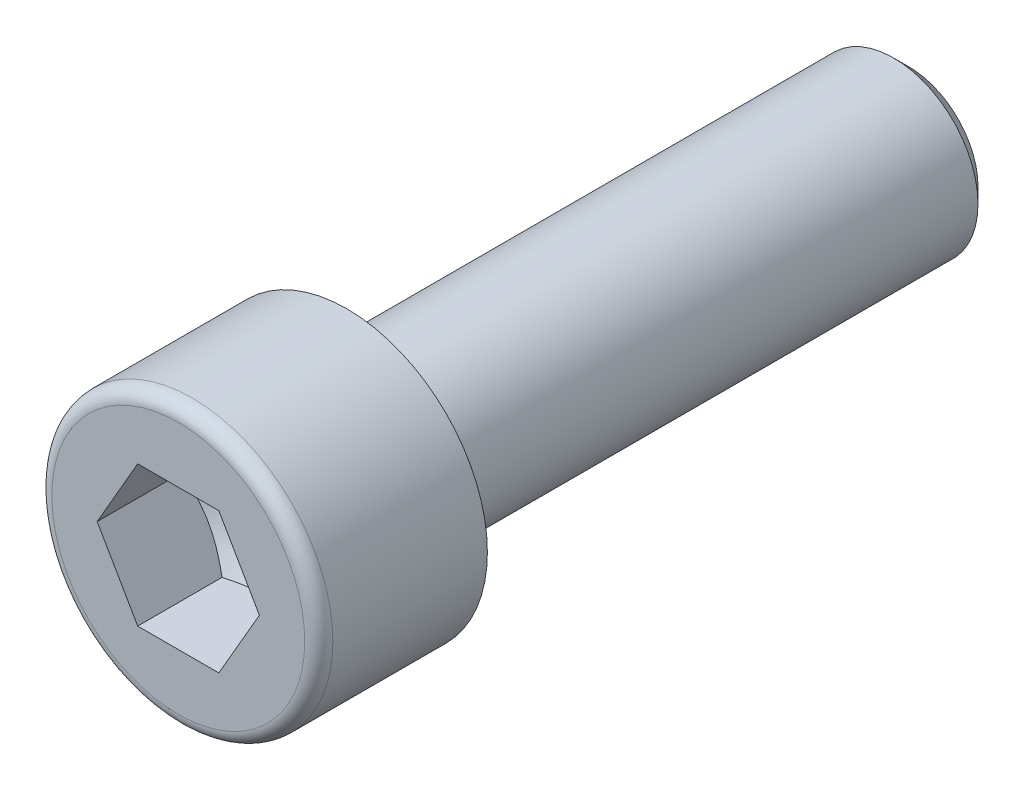
ISO-10303-21;
HEADER;
FILE_DESCRIPTION(('STEP AP214'),'2;1');
FILE_NAME('part.step','',(''),(''),'','','');
FILE_SCHEMA(('AUTOMOTIVE_DESIGN { 1 0 10303 214 1 1 1 1 }'));
ENDSEC;
DATA;
#1=APPLICATION_CONTEXT('core data for automotive mechanical design processes');
#2=APPLICATION_PROTOCOL_DEFINITION('international standard','automotive_design',2000,#1);
#3=PRODUCT_CONTEXT('',#1,'mechanical');
#4=PRODUCT('Part','Part','',(#3));
#5=PRODUCT_RELATED_PRODUCT_CATEGORY('part','',(#4));
#6=PRODUCT_DEFINITION_FORMATION('','',#4);
#7=PRODUCT_DEFINITION_CONTEXT('part definition',#1,'design');
#8=PRODUCT_DEFINITION('design','',#6,#7);
#9=PRODUCT_DEFINITION_SHAPE('','',#8);
#10=(LENGTH_UNIT() NAMED_UNIT(*) SI_UNIT(.MILLI.,.METRE.));
#11=(NAMED_UNIT(*) PLANE_ANGLE_UNIT() SI_UNIT($,.RADIAN.));
#12=(NAMED_UNIT(*) SI_UNIT($,.STERADIAN.) SOLID_ANGLE_UNIT());
#13=UNCERTAINTY_MEASURE_WITH_UNIT(LENGTH_MEASURE(1.E-05),#10,'distance_accuracy_value','');
#14=(GEOMETRIC_REPRESENTATION_CONTEXT(3) GLOBAL_UNCERTAINTY_ASSIGNED_CONTEXT((#13)) GLOBAL_UNIT_ASSIGNED_CONTEXT((#10,
#11,#12)) REPRESENTATION_CONTEXT('',''));
#15=CARTESIAN_POINT('',(0.,0.,0.));
#16=DIRECTION('',(0.,0.,1.));
#17=DIRECTION('',(1.,0.,0.));
#18=AXIS2_PLACEMENT_3D('',#15,#16,#17);
#19=CARTESIAN_POINT('',(0.,0.,6.));
#20=DIRECTION('',(0.,0.,1.));
#21=DIRECTION('',(1.,0.,0.));
#22=AXIS2_PLACEMENT_3D('',#19,#20,#21);
#23=PLANE('',#22);
#24=CARTESIAN_POINT('',(0.,0.,6.));
#25=DIRECTION('',(0.,0.,1.));
#26=DIRECTION('',(1.,0.,0.));
#27=AXIS2_PLACEMENT_3D('',#24,#25,#26);
#28=CIRCLE('',#27,4.5);
#29=CARTESIAN_POINT('',(4.5,0.,6.));
#30=VERTEX_POINT('',#29);
#31=EDGE_CURVE('E11',#30,#30,#28,.T.);
#32=ORIENTED_EDGE('',*,*,#31,.T.);
#33=EDGE_LOOP('',(#32));
#34=FACE_BOUND('',#33,.T.);
#35=DIRECTION('',(1.,0.,0.));
#36=VECTOR('',#35,1.);
#37=CARTESIAN_POINT('',(-1.443375,2.49999883437473,6.));
#38=LINE('',#37,#36);
#39=CARTESIAN_POINT('',(-1.443375,2.49999883437473,6.));
#40=VERTEX_POINT('',#39);
#41=CARTESIAN_POINT('',(1.443375,2.49999883437473,6.));
#42=VERTEX_POINT('',#41);
#43=EDGE_CURVE('E91',#40,#42,#38,.T.);
#44=ORIENTED_EDGE('',*,*,#43,.T.);
#45=DIRECTION('',(0.5,-0.866025403784439,0.));
#46=VECTOR('',#45,1.);
#47=CARTESIAN_POINT('',(1.443375,2.49999883437473,6.));
#48=LINE('',#47,#46);
#49=CARTESIAN_POINT('',(2.88675,0.,6.));
#50=VERTEX_POINT('',#49);
#51=EDGE_CURVE('E30',#42,#50,#48,.T.);
#52=ORIENTED_EDGE('',*,*,#51,.T.);
#53=DIRECTION('',(-0.5,-0.866025403784439,0.));
#54=VECTOR('',#53,1.);
#55=CARTESIAN_POINT('',(2.88675,0.,6.));
#56=LINE('',#55,#54);
#57=CARTESIAN_POINT('',(1.443375,-2.49999883437473,6.));
#58=VERTEX_POINT('',#57);
#59=EDGE_CURVE('E168',#50,#58,#56,.T.);
#60=ORIENTED_EDGE('',*,*,#59,.T.);
#61=DIRECTION('',(-1.,0.,0.));
#62=VECTOR('',#61,1.);
#63=CARTESIAN_POINT('',(1.443375,-2.49999883437473,6.));
#64=LINE('',#63,#62);
#65=CARTESIAN_POINT('',(-1.443375,-2.49999883437473,6.));
#66=VERTEX_POINT('',#65);
#67=EDGE_CURVE('E164',#58,#66,#64,.T.);
#68=ORIENTED_EDGE('',*,*,#67,.T.);
#69=DIRECTION('',(-0.5,0.866025403784439,0.));
#70=VECTOR('',#69,1.);
#71=CARTESIAN_POINT('',(-1.443375,-2.49999883437473,6.));
#72=LINE('',#71,#70);
#73=CARTESIAN_POINT('',(-2.88675,0.,6.));
#74=VERTEX_POINT('',#73);
#75=EDGE_CURVE('E159',#66,#74,#72,.T.);
#76=ORIENTED_EDGE('',*,*,#75,.T.);
#77=DIRECTION('',(0.5,0.866025403784439,0.));
#78=VECTOR('',#77,1.);
#79=CARTESIAN_POINT('',(-2.88675,0.,6.));
#80=LINE('',#79,#78);
#81=EDGE_CURVE('E95',#74,#40,#80,.T.);
#82=ORIENTED_EDGE('',*,*,#81,.T.);
#83=EDGE_LOOP('',(#44,#52,#60,#68,#76,#82));
#84=FACE_BOUND('',#83,.T.);
#85=ADVANCED_FACE('F16',(#34,#84),#23,.T.);
#86=CARTESIAN_POINT('',(0.,0.,5.5));
#87=DIRECTION('',(0.,0.,1.));
#88=DIRECTION('',(1.,0.,0.));
#89=AXIS2_PLACEMENT_3D('',#86,#87,#88);
#90=TOROIDAL_SURFACE('',#89,4.5,0.5);
#91=ORIENTED_EDGE('',*,*,#31,.F.);
#92=EDGE_LOOP('',(#91));
#93=FACE_BOUND('',#92,.T.);
#94=CARTESIAN_POINT('',(0.,0.,5.5));
#95=DIRECTION('',(0.,0.,1.));
#96=DIRECTION('',(1.,0.,0.));
#97=AXIS2_PLACEMENT_3D('',#94,#95,#96);
#98=CIRCLE('',#97,5.);
#99=CARTESIAN_POINT('',(5.,0.,5.5));
#100=VERTEX_POINT('',#99);
#101=EDGE_CURVE('E23',#100,#100,#98,.T.);
#102=ORIENTED_EDGE('',*,*,#101,.T.);
#103=EDGE_LOOP('',(#102));
#104=FACE_BOUND('',#103,.T.);
#105=ADVANCED_FACE('F132',(#93,#104),#90,.T.);
#106=CARTESIAN_POINT('',(0.,0.,6.));
#107=DIRECTION('',(0.,0.,1.));
#108=DIRECTION('',(1.,0.,0.));
#109=AXIS2_PLACEMENT_3D('',#106,#107,#108);
#110=CYLINDRICAL_SURFACE('',#109,5.);
#111=CARTESIAN_POINT('',(0.,0.,0.));
#112=DIRECTION('',(0.,0.,1.));
#113=DIRECTION('',(1.,0.,0.));
#114=AXIS2_PLACEMENT_3D('',#111,#112,#113);
#115=CIRCLE('',#114,5.);
#116=CARTESIAN_POINT('',(5.,0.,0.));
#117=VERTEX_POINT('',#116);
#118=EDGE_CURVE('E127',#117,#117,#115,.T.);
#119=ORIENTED_EDGE('',*,*,#118,.T.);
#120=EDGE_LOOP('',(#119));
#121=FACE_BOUND('',#120,.T.);
#122=ORIENTED_EDGE('',*,*,#101,.F.);
#123=EDGE_LOOP('',(#122));
#124=FACE_BOUND('',#123,.T.);
#125=ADVANCED_FACE('F134',(#121,#124),#110,.T.);
#126=CARTESIAN_POINT('',(0.,5.,0.));
#127=DIRECTION('',(0.,0.,-1.));
#128=DIRECTION('',(-1.,0.,0.));
#129=AXIS2_PLACEMENT_3D('',#126,#127,#128);
#130=PLANE('',#129);
#131=CARTESIAN_POINT('',(0.,0.,0.));
#132=DIRECTION('',(0.,0.,1.));
#133=DIRECTION('',(1.,0.,0.));
#134=AXIS2_PLACEMENT_3D('',#131,#132,#133);
#135=CIRCLE('',#134,3.3);
#136=CARTESIAN_POINT('',(3.3,0.,0.));
#137=VERTEX_POINT('',#136);
#138=EDGE_CURVE('E124',#137,#137,#135,.T.);
#139=ORIENTED_EDGE('',*,*,#138,.T.);
#140=EDGE_LOOP('',(#139));
#141=FACE_BOUND('',#140,.T.);
#142=ORIENTED_EDGE('',*,*,#118,.F.);
#143=EDGE_LOOP('',(#142));
#144=FACE_BOUND('',#143,.T.);
#145=ADVANCED_FACE('F136',(#141,#144),#130,.T.);
#146=CARTESIAN_POINT('',(0.,0.,-0.3));
#147=DIRECTION('',(0.,0.,1.));
#148=DIRECTION('',(1.,0.,0.));
#149=AXIS2_PLACEMENT_3D('',#146,#147,#148);
#150=TOROIDAL_SURFACE('',#149,3.3,0.3);
#151=CARTESIAN_POINT('',(0.,0.,-0.3));
#152=DIRECTION('',(0.,0.,1.));
#153=DIRECTION('',(1.,0.,0.));
#154=AXIS2_PLACEMENT_3D('',#151,#152,#153);
#155=CIRCLE('',#154,3.);
#156=CARTESIAN_POINT('',(3.,0.,-0.3));
#157=VERTEX_POINT('',#156);
#158=EDGE_CURVE('E121',#157,#157,#155,.T.);
#159=ORIENTED_EDGE('',*,*,#158,.T.);
#160=EDGE_LOOP('',(#159));
#161=FACE_BOUND('',#160,.T.);
#162=ORIENTED_EDGE('',*,*,#138,.F.);
#163=EDGE_LOOP('',(#162));
#164=FACE_BOUND('',#163,.T.);
#165=ADVANCED_FACE('F144',(#161,#164),#150,.F.);
#166=CARTESIAN_POINT('',(0.,0.,6.));
#167=DIRECTION('',(0.,0.,1.));
#168=DIRECTION('',(1.,0.,0.));
#169=AXIS2_PLACEMENT_3D('',#166,#167,#168);
#170=CYLINDRICAL_SURFACE('',#169,3.);
#171=CARTESIAN_POINT('',(0.,0.,-0.301));
#172=DIRECTION('',(0.,0.,1.));
#173=DIRECTION('',(1.,0.,0.));
#174=AXIS2_PLACEMENT_3D('',#171,#172,#173);
#175=CIRCLE('',#174,3.);
#176=CARTESIAN_POINT('',(3.,0.,-0.301));
#177=VERTEX_POINT('',#176);
#178=EDGE_CURVE('E118',#177,#177,#175,.T.);
#179=ORIENTED_EDGE('',*,*,#178,.T.);
#180=EDGE_LOOP('',(#179));
#181=FACE_BOUND('',#180,.T.);
#182=ORIENTED_EDGE('',*,*,#158,.F.);
#183=EDGE_LOOP('',(#182));
#184=FACE_BOUND('',#183,.T.);
#185=ADVANCED_FACE('F363',(#181,#184),#170,.T.);
#186=CARTESIAN_POINT('',(0.,0.,-0.301));
#187=DIRECTION('',(0.,0.,1.));
#188=DIRECTION('',(1.,0.,0.));
#189=AXIS2_PLACEMENT_3D('',#186,#187,#188);
#190=CONICAL_SURFACE('',#189,3.,0.523598775598299);
#191=CARTESIAN_POINT('',(0.,0.,-1.23847249959665));
#192=DIRECTION('',(0.,0.,1.));
#193=DIRECTION('',(1.,0.,0.));
#194=AXIS2_PLACEMENT_3D('',#191,#192,#193);
#195=CIRCLE('',#194,2.45875);
#196=CARTESIAN_POINT('',(2.45875,0.,-1.23847249959665));
#197=VERTEX_POINT('',#196);
#198=EDGE_CURVE('E115',#197,#197,#195,.T.);
#199=ORIENTED_EDGE('',*,*,#198,.T.);
#200=EDGE_LOOP('',(#199));
#201=FACE_BOUND('',#200,.T.);
#202=ORIENTED_EDGE('',*,*,#178,.F.);
#203=EDGE_LOOP('',(#202));
#204=FACE_BOUND('',#203,.T.);
#205=ADVANCED_FACE('F352',(#201,#204),#190,.T.);
#206=CARTESIAN_POINT('',(0.,2.45875,-1.23847249959665));
#207=DIRECTION('',(0.,0.,1.));
#208=DIRECTION('',(1.,0.,0.));
#209=AXIS2_PLACEMENT_3D('',#206,#207,#208);
#210=PLANE('',#209);
#211=CARTESIAN_POINT('',(0.,0.,-1.23847249959665));
#212=DIRECTION('',(0.,0.,1.));
#213=DIRECTION('',(1.,0.,0.));
#214=AXIS2_PLACEMENT_3D('',#211,#212,#213);
#215=CIRCLE('',#214,3.);
#216=CARTESIAN_POINT('',(3.,0.,-1.23847249959665));
#217=VERTEX_POINT('',#216);
#218=EDGE_CURVE('E112',#217,#217,#215,.T.);
#219=ORIENTED_EDGE('',*,*,#218,.T.);
#220=EDGE_LOOP('',(#219));
#221=FACE_BOUND('',#220,.T.);
#222=ORIENTED_EDGE('',*,*,#198,.F.);
#223=EDGE_LOOP('',(#222));
#224=FACE_BOUND('',#223,.T.);
#225=ADVANCED_FACE('F341',(#221,#224),#210,.T.);
#226=CARTESIAN_POINT('',(0.,0.,6.));
#227=DIRECTION('',(0.,0.,1.));
#228=DIRECTION('',(1.,0.,0.));
#229=AXIS2_PLACEMENT_3D('',#226,#227,#228);
#230=CYLINDRICAL_SURFACE('',#229,3.);
#231=CARTESIAN_POINT('',(0.,0.,-19.45875));
#232=DIRECTION('',(0.,0.,1.));
#233=DIRECTION('',(1.,0.,0.));
#234=AXIS2_PLACEMENT_3D('',#231,#232,#233);
#235=CIRCLE('',#234,3.);
#236=CARTESIAN_POINT('',(3.,0.,-19.45875));
#237=VERTEX_POINT('',#236);
#238=EDGE_CURVE('E109',#237,#237,#235,.T.);
#239=ORIENTED_EDGE('',*,*,#238,.T.);
#240=EDGE_LOOP('',(#239));
#241=FACE_BOUND('',#240,.T.);
#242=ORIENTED_EDGE('',*,*,#218,.F.);
#243=EDGE_LOOP('',(#242));
#244=FACE_BOUND('',#243,.T.);
#245=ADVANCED_FACE('F330',(#241,#244),#230,.T.);
#246=CARTESIAN_POINT('',(0.,0.,-19.45875));
#247=DIRECTION('',(0.,0.,1.));
#248=DIRECTION('',(1.,0.,0.));
#249=AXIS2_PLACEMENT_3D('',#246,#247,#248);
#250=CONICAL_SURFACE('',#249,3.,0.78539816339745);
#251=CARTESIAN_POINT('',(0.,0.,-20.));
#252=DIRECTION('',(0.,0.,1.));
#253=DIRECTION('',(1.,0.,0.));
#254=AXIS2_PLACEMENT_3D('',#251,#252,#253);
#255=CIRCLE('',#254,2.45875);
#256=CARTESIAN_POINT('',(2.45875,0.,-20.));
#257=VERTEX_POINT('',#256);
#258=EDGE_CURVE('E106',#257,#257,#255,.T.);
#259=ORIENTED_EDGE('',*,*,#258,.T.);
#260=EDGE_LOOP('',(#259));
#261=FACE_BOUND('',#260,.T.);
#262=ORIENTED_EDGE('',*,*,#238,.F.);
#263=EDGE_LOOP('',(#262));
#264=FACE_BOUND('',#263,.T.);
#265=ADVANCED_FACE('F320',(#261,#264),#250,.T.);
#266=CARTESIAN_POINT('',(0.,2.45875,-20.));
#267=DIRECTION('',(0.,0.,-1.));
#268=DIRECTION('',(-1.,0.,0.));
#269=AXIS2_PLACEMENT_3D('',#266,#267,#268);
#270=PLANE('',#269);
#271=ORIENTED_EDGE('',*,*,#258,.F.);
#272=EDGE_LOOP('',(#271));
#273=FACE_BOUND('',#272,.T.);
#274=ADVANCED_FACE('F224',(#273),#270,.T.);
#275=CARTESIAN_POINT('',(1.443375,2.49999883437473,1.33333411041685));
#276=DIRECTION('',(-0.866025403784439,-0.5,0.));
#277=DIRECTION('',(-0.5,0.866025403784439,0.));
#278=AXIS2_PLACEMENT_3D('',#275,#276,#277);
#279=PLANE('',#278);
#280=DIRECTION('',(0.,0.,1.));
#281=VECTOR('',#280,1.);
#282=CARTESIAN_POINT('',(2.88675,0.,1.33333411041685));
#283=LINE('',#282,#281);
#284=CARTESIAN_POINT('',(2.88675,0.,3.));
#285=VERTEX_POINT('',#284);
#286=EDGE_CURVE('E104',#285,#50,#283,.T.);
#287=ORIENTED_EDGE('',*,*,#286,.T.);
#288=ORIENTED_EDGE('',*,*,#51,.F.);
#289=DIRECTION('',(0.,0.,1.));
#290=VECTOR('',#289,1.);
#291=CARTESIAN_POINT('',(1.443375,2.49999883437473,1.33333411041685));
#292=LINE('',#291,#290);
#293=CARTESIAN_POINT('',(1.443375,2.49999883437473,3.));
#294=VERTEX_POINT('',#293);
#295=EDGE_CURVE('E85',#294,#42,#292,.T.);
#296=ORIENTED_EDGE('',*,*,#295,.F.);
#297=CARTESIAN_POINT('',(2.88675011547006,-1.99999999863357E-07,3.00000006666667));
#298=CARTESIAN_POINT('',(2.82332252366581,0.10985961160669,2.96336950967828));
#299=CARTESIAN_POINT('',(2.75934742579574,0.220667731536841,2.93005593436152));
#300=CARTESIAN_POINT('',(2.63028954387127,0.444202540147256,2.87190808727666));
#301=CARTESIAN_POINT('',(2.56520446745334,0.556933199317605,2.84709438377072));
#302=CARTESIAN_POINT('',(2.43584088140159,0.780997503008549,2.80847006268835));
#303=CARTESIAN_POINT('',(2.37158227044588,0.892296682007636,2.7944023489199));
#304=CARTESIAN_POINT('',(2.24276284805613,1.11541846658835,2.77761157054617));
#305=CARTESIAN_POINT('',(2.17820250452486,1.22724026173863,2.77487459839365));
#306=CARTESIAN_POINT('',(2.05757841328359,1.43616731638533,2.78058295689796));
#307=CARTESIAN_POINT('',(2.00149656500914,1.53330392697905,2.7876266963322));
#308=CARTESIAN_POINT('',(1.8896982234341,1.72694433478895,2.80994670830941));
#309=CARTESIAN_POINT('',(1.83398211652594,1.82344746275382,2.82523059787334));
#310=CARTESIAN_POINT('',(1.72195345954662,2.01748678854571,2.86343736615338));
#311=CARTESIAN_POINT('',(1.66565508107193,2.11499844044762,2.88652212541071));
#312=CARTESIAN_POINT('',(1.55389777191142,2.3085677780308,2.93891477048972));
#313=CARTESIAN_POINT('',(1.49843741058811,2.40462794164891,2.96821035401504));
#314=CARTESIAN_POINT('',(1.44337488452994,2.49999903437473,3.00000006666667));
#315=B_SPLINE_CURVE_WITH_KNOTS('',3,(#297,#298,#299,#300,#301,#302,#303,#304,#305,#306,#307,
#308,#309,#310,#311,#312,#313,#314),.UNSPECIFIED.,.F.,.F.,(4,2,2,2,2,2,2,2,4),(0.,
0.396269845497158,0.793491933375094,1.18088400346178,1.56780044062153,1.90463400294076,
2.24177946228527,2.58640119548574,2.93034658115087),.UNSPECIFIED.);
#316=EDGE_CURVE('E78',#285,#294,#315,.T.);
#317=ORIENTED_EDGE('',*,*,#316,.F.);
#318=EDGE_LOOP('',(#287,#288,#296,#317));
#319=FACE_BOUND('',#318,.T.);
#320=ADVANCED_FACE('F86',(#319),#279,.T.);
#321=CARTESIAN_POINT('',(2.88675,0.,1.33333411041685));
#322=DIRECTION('',(-0.866025403784439,0.5,0.));
#323=DIRECTION('',(0.5,0.866025403784439,0.));
#324=AXIS2_PLACEMENT_3D('',#321,#322,#323);
#325=PLANE('',#324);
#326=DIRECTION('',(0.,0.,1.));
#327=VECTOR('',#326,1.);
#328=CARTESIAN_POINT('',(1.443375,-2.49999883437473,1.33333411041685));
#329=LINE('',#328,#327);
#330=CARTESIAN_POINT('',(1.443375,-2.49999883437473,3.));
#331=VERTEX_POINT('',#330);
#332=EDGE_CURVE('E102',#331,#58,#329,.T.);
#333=ORIENTED_EDGE('',*,*,#332,.T.);
#334=ORIENTED_EDGE('',*,*,#59,.F.);
#335=ORIENTED_EDGE('',*,*,#286,.F.);
#336=CARTESIAN_POINT('',(1.44337488452995,-2.49999903437473,3.00000006666667));
#337=CARTESIAN_POINT('',(1.50680247633419,-2.39013922276804,2.96336950967828));
#338=CARTESIAN_POINT('',(1.57077757420426,-2.27933110283789,2.93005593436152));
#339=CARTESIAN_POINT('',(1.69983545612873,-2.05579629422747,2.87190808727666));
#340=CARTESIAN_POINT('',(1.76492053254666,-1.94306563505712,2.84709438377072));
#341=CARTESIAN_POINT('',(1.89428411859841,-1.71900133136618,2.80847006268835));
#342=CARTESIAN_POINT('',(1.95854272955412,-1.60770215236709,2.7944023489199));
#343=CARTESIAN_POINT('',(2.08736215194387,-1.38458036778637,2.77761157054617));
#344=CARTESIAN_POINT('',(2.15192249547514,-1.2727585726361,2.77487459839365));
#345=CARTESIAN_POINT('',(2.27254658671641,-1.06383151798939,2.78058295689796));
#346=CARTESIAN_POINT('',(2.32862843499086,-0.96669490739568,2.7876266963322));
#347=CARTESIAN_POINT('',(2.4404267765659,-0.773054499585779,2.8099467083094));
#348=CARTESIAN_POINT('',(2.49614288347406,-0.676551371620907,2.82523059787334));
#349=CARTESIAN_POINT('',(2.60817154045338,-0.48251204582902,2.86343736615338));
#350=CARTESIAN_POINT('',(2.66446991892807,-0.385000393927105,2.88652212541071));
#351=CARTESIAN_POINT('',(2.77622722808858,-0.191431056343928,2.93891477048972));
#352=CARTESIAN_POINT('',(2.83168758941189,-0.0953708927258217,2.96821035401504));
#353=CARTESIAN_POINT('',(2.88675011547006,1.99999999976406E-07,3.00000006666667));
#354=B_SPLINE_CURVE_WITH_KNOTS('',3,(#336,#337,#338,#339,#340,#341,#342,#343,#344,#345,#346,
#347,#348,#349,#350,#351,#352,#353),.UNSPECIFIED.,.F.,.F.,(4,2,2,2,2,2,2,2,4),(0.,
0.396269845497159,0.793491933375095,1.18088400346178,1.56780044062153,1.90463400294076,
2.24177946228527,2.58640119548574,2.93034658115087),.UNSPECIFIED.);
#355=EDGE_CURVE('E82',#331,#285,#354,.T.);
#356=ORIENTED_EDGE('',*,*,#355,.F.);
#357=EDGE_LOOP('',(#333,#334,#335,#356));
#358=FACE_BOUND('',#357,.T.);
#359=ADVANCED_FACE('F215',(#358),#325,.T.);
#360=CARTESIAN_POINT('',(1.443375,-2.49999883437473,1.33333411041685));
#361=DIRECTION('',(0.,1.,0.));
#362=DIRECTION('',(1.,0.,0.));
#363=AXIS2_PLACEMENT_3D('',#360,#361,#362);
#364=PLANE('',#363);
#365=DIRECTION('',(0.,0.,1.));
#366=VECTOR('',#365,1.);
#367=CARTESIAN_POINT('',(-1.443375,-2.49999883437473,1.33333411041685));
#368=LINE('',#367,#366);
#369=CARTESIAN_POINT('',(-1.443375,-2.49999883437473,3.));
#370=VERTEX_POINT('',#369);
#371=EDGE_CURVE('E100',#370,#66,#368,.T.);
#372=ORIENTED_EDGE('',*,*,#371,.T.);
#373=ORIENTED_EDGE('',*,*,#67,.F.);
#374=ORIENTED_EDGE('',*,*,#332,.F.);
#375=CARTESIAN_POINT('',(-3.73786106214978,-2.49999883437473,3.92958778907324));
#376=CARTESIAN_POINT('',(-3.62896491195938,-2.49999883437473,3.87734398831161));
#377=CARTESIAN_POINT('',(-3.51980131110672,-2.49999883437473,3.82564701620672));
#378=CARTESIAN_POINT('',(-3.30079453275696,-2.49999883437473,3.72366066581967));
#379=CARTESIAN_POINT('',(-3.19095123199839,-2.49999883437473,3.67337155256083));
#380=CARTESIAN_POINT('',(-2.96980741137606,-2.49999883437473,3.57423266172552));
#381=CARTESIAN_POINT('',(-2.85850208851781,-2.49999883437473,3.5253935570836));
#382=CARTESIAN_POINT('',(-2.63494533066189,-2.49999883437473,3.42993961665011));
#383=CARTESIAN_POINT('',(-2.52269394848717,-2.49999883437473,3.38332465762953));
#384=CARTESIAN_POINT('',(-2.2960796228752,-2.49999883437473,3.29252281771904));
#385=CARTESIAN_POINT('',(-2.18170681392527,-2.49999883437473,3.2483604168365));
#386=CARTESIAN_POINT('',(-1.95158478593381,-2.49999883437473,3.16370836718421));
#387=CARTESIAN_POINT('',(-1.83583541308941,-2.49999883437473,3.12321913326025));
#388=CARTESIAN_POINT('',(-1.60304799958039,-2.49999883437473,3.04706130714345));
#389=CARTESIAN_POINT('',(-1.4860136544433,-2.49999883437473,3.01138153954989));
#390=CARTESIAN_POINT('',(-1.25028155584969,-2.49999883437473,2.94604587235114));
#391=CARTESIAN_POINT('',(-1.13158421230429,-2.49999883437473,2.91638851527048));
#392=CARTESIAN_POINT('',(-0.892146141983619,-2.49999883437473,2.86451911091829));
#393=CARTESIAN_POINT('',(-0.771400115486069,-2.49999883437473,2.84233105195638));
#394=CARTESIAN_POINT('',(-0.528550538126974,-2.49999883437473,2.8070567548414));
#395=CARTESIAN_POINT('',(-0.406446967923683,-2.49999883437473,2.7939706465386));
#396=CARTESIAN_POINT('',(-0.162227421037293,-2.49999883437473,2.77805851853028));
#397=CARTESIAN_POINT('',(-0.0401151733531879,-2.49999883437473,2.77517671003708));
#398=CARTESIAN_POINT('',(0.203885891243259,-2.49999883437473,2.77978959871521));
#399=CARTESIAN_POINT('',(0.325774751512606,-2.49999883437473,2.78728200631532));
#400=CARTESIAN_POINT('',(0.536617165080476,-2.49999883437473,2.80870547357712));
#401=CARTESIAN_POINT('',(0.625806204585235,-2.49999883437473,2.82042640123085));
#402=CARTESIAN_POINT('',(0.803437024790562,-2.49999883437473,2.84861382064688));
#403=CARTESIAN_POINT('',(0.891878680031716,-2.49999883437473,2.86508109348135));
#404=CARTESIAN_POINT('',(1.1562492807378,-2.49999883437473,2.92077504184743));
#405=CARTESIAN_POINT('',(1.3308708069745,-2.49999883437473,2.96625356320288));
#406=CARTESIAN_POINT('',(1.59190160301469,-2.49999883437473,3.04393162478608));
#407=CARTESIAN_POINT('',(1.67969059973094,-2.49999883437473,3.0717495689676));
#408=CARTESIAN_POINT('',(1.85442096143946,-2.49999883437473,3.12997740734101));
#409=CARTESIAN_POINT('',(1.94136225311569,-2.49999883437473,3.16038752354637));
#410=CARTESIAN_POINT('',(2.1139610250156,-2.49999883437473,3.22316216485984));
#411=CARTESIAN_POINT('',(2.19962301770649,-2.49999883437473,3.25551440549188));
#412=CARTESIAN_POINT('',(2.37023194830679,-2.49999883437473,3.32197432045096));
#413=CARTESIAN_POINT('',(2.45517911361762,-2.49999883437473,3.35608140990558));
#414=CARTESIAN_POINT('',(2.53982745281954,-2.49999883437473,3.3908988248281));
#415=B_SPLINE_CURVE_WITH_KNOTS('',3,(#375,#376,#377,#378,#379,#380,#381,#382,#383,#384,#385,
#386,#387,#388,#389,#390,#391,#392,#393,#394,#395,#396,#397,#398,#399,#400,#401,#402,#403,#404,
#405,#406,#407,#408,#409,#410,#411,#412,#413,#414),.UNSPECIFIED.,.F.,.F.,(4,2,2,2,2,2,2,2,2,2,2,
2,2,2,2,2,2,2,2,4),(0.,0.362345077461351,0.724757912306451,1.08938530048732,1.45399246293536,
1.82175226930555,2.18955355872751,2.55648491480033,2.92332736420018,3.29133696448628,
3.65935181476395,4.02535152666688,4.39127047595122,4.66100477488141,4.93078348742953,
5.47140222651042,5.74765583222639,6.02393312223645,6.29861688003657,6.57320967433308),.UNSPECIFIED.);
#416=EDGE_CURVE('E206',#370,#331,#415,.T.);
#417=ORIENTED_EDGE('',*,*,#416,.F.);
#418=EDGE_LOOP('',(#372,#373,#374,#417));
#419=FACE_BOUND('',#418,.T.);
#420=ADVANCED_FACE('F211',(#419),#364,.T.);
#421=CARTESIAN_POINT('',(-1.443375,-2.49999883437473,1.33333411041685));
#422=DIRECTION('',(0.866025403784439,0.5,0.));
#423=DIRECTION('',(0.5,-0.866025403784439,0.));
#424=AXIS2_PLACEMENT_3D('',#421,#422,#423);
#425=PLANE('',#424);
#426=DIRECTION('',(0.,0.,1.));
#427=VECTOR('',#426,1.);
#428=CARTESIAN_POINT('',(-2.88675,0.,1.33333411041685));
#429=LINE('',#428,#427);
#430=CARTESIAN_POINT('',(-2.88675,0.,3.));
#431=VERTEX_POINT('',#430);
#432=EDGE_CURVE('E93',#431,#74,#429,.T.);
#433=ORIENTED_EDGE('',*,*,#432,.T.);
#434=ORIENTED_EDGE('',*,*,#75,.F.);
#435=ORIENTED_EDGE('',*,*,#371,.F.);
#436=CARTESIAN_POINT('',(-2.88675011547006,2.E-07,3.00000006666667));
#437=CARTESIAN_POINT('',(-2.82332252366581,-0.109859611606689,2.96336950967828));
#438=CARTESIAN_POINT('',(-2.75934742579574,-0.220667731536841,2.93005593436152));
#439=CARTESIAN_POINT('',(-2.63028954387127,-0.444202540147256,2.87190808727666));
#440=CARTESIAN_POINT('',(-2.56520446745334,-0.556933199317605,2.84709438377072));
#441=CARTESIAN_POINT('',(-2.43584088140159,-0.78099750300855,2.80847006268835));
#442=CARTESIAN_POINT('',(-2.37158227044588,-0.892296682007636,2.7944023489199));
#443=CARTESIAN_POINT('',(-2.24276284805613,-1.11541846658835,2.77761157054617));
#444=CARTESIAN_POINT('',(-2.17820250452486,-1.22724026173863,2.77487459839365));
#445=CARTESIAN_POINT('',(-2.05757841328359,-1.43616731638533,2.78058295689796));
#446=CARTESIAN_POINT('',(-2.00149656500914,-1.53330392697905,2.7876266963322));
#447=CARTESIAN_POINT('',(-1.8896982234341,-1.72694433478895,2.80994670830941));
#448=CARTESIAN_POINT('',(-1.83398211652594,-1.82344746275382,2.82523059787334));
#449=CARTESIAN_POINT('',(-1.72195345954662,-2.01748678854571,2.86343736615338));
#450=CARTESIAN_POINT('',(-1.66565508107193,-2.11499844044762,2.88652212541071));
#451=CARTESIAN_POINT('',(-1.55389777191142,-2.3085677780308,2.93891477048972));
#452=CARTESIAN_POINT('',(-1.49843741058811,-2.40462794164891,2.96821035401504));
#453=CARTESIAN_POINT('',(-1.44337488452995,-2.49999903437473,3.00000006666667));
#454=B_SPLINE_CURVE_WITH_KNOTS('',3,(#436,#437,#438,#439,#440,#441,#442,#443,#444,#445,#446,
#447,#448,#449,#450,#451,#452,#453),.UNSPECIFIED.,.F.,.F.,(4,2,2,2,2,2,2,2,4),(0.,
0.396269845497158,0.793491933375094,1.18088400346178,1.56780044062153,1.90463400294076,
2.24177946228527,2.58640119548574,2.93034658115087),.UNSPECIFIED.);
#455=EDGE_CURVE('E201',#431,#370,#454,.T.);
#456=ORIENTED_EDGE('',*,*,#455,.F.);
#457=EDGE_LOOP('',(#433,#434,#435,#456));
#458=FACE_BOUND('',#457,.T.);
#459=ADVANCED_FACE('F214',(#458),#425,.T.);
#460=CARTESIAN_POINT('',(-2.88675,0.,1.33333411041685));
#461=DIRECTION('',(0.866025403784439,-0.5,0.));
#462=DIRECTION('',(-0.5,-0.866025403784439,0.));
#463=AXIS2_PLACEMENT_3D('',#460,#461,#462);
#464=PLANE('',#463);
#465=DIRECTION('',(0.,0.,1.));
#466=VECTOR('',#465,1.);
#467=CARTESIAN_POINT('',(-1.443375,2.49999883437473,1.33333411041685));
#468=LINE('',#467,#466);
#469=CARTESIAN_POINT('',(-1.443375,2.49999883437473,3.));
#470=VERTEX_POINT('',#469);
#471=EDGE_CURVE('E90',#470,#40,#468,.T.);
#472=ORIENTED_EDGE('',*,*,#471,.T.);
#473=ORIENTED_EDGE('',*,*,#81,.F.);
#474=ORIENTED_EDGE('',*,*,#432,.F.);
#475=CARTESIAN_POINT('',(-1.44337488452995,2.49999903437473,3.00000006666667));
#476=CARTESIAN_POINT('',(-1.50680247633419,2.39013922276804,2.96336950967828));
#477=CARTESIAN_POINT('',(-1.57077757420426,2.27933110283789,2.93005593436152));
#478=CARTESIAN_POINT('',(-1.69983545612874,2.05579629422747,2.87190808727665));
#479=CARTESIAN_POINT('',(-1.76492053254666,1.94306563505712,2.84709438377072));
#480=CARTESIAN_POINT('',(-1.89428411859841,1.71900133136618,2.80847006268835));
#481=CARTESIAN_POINT('',(-1.95854272955412,1.60770215236709,2.7944023489199));
#482=CARTESIAN_POINT('',(-2.08736215194387,1.38458036778637,2.77761157054617));
#483=CARTESIAN_POINT('',(-2.15192249547514,1.2727585726361,2.77487459839365));
#484=CARTESIAN_POINT('',(-2.27254658671641,1.06383151798939,2.78058295689796));
#485=CARTESIAN_POINT('',(-2.32862843499086,0.966694907395678,2.7876266963322));
#486=CARTESIAN_POINT('',(-2.4404267765659,0.773054499585779,2.8099467083094));
#487=CARTESIAN_POINT('',(-2.49614288347406,0.676551371620906,2.82523059787334));
#488=CARTESIAN_POINT('',(-2.60817154045338,0.48251204582902,2.86343736615338));
#489=CARTESIAN_POINT('',(-2.66446991892807,0.385000393927105,2.88652212541071));
#490=CARTESIAN_POINT('',(-2.77622722808858,0.191431056343928,2.93891477048972));
#491=CARTESIAN_POINT('',(-2.83168758941189,0.0953708927258217,2.96821035401504));
#492=CARTESIAN_POINT('',(-2.88675011547006,-2.00000000044562E-07,3.00000006666667));
#493=B_SPLINE_CURVE_WITH_KNOTS('',3,(#475,#476,#477,#478,#479,#480,#481,#482,#483,#484,#485,
#486,#487,#488,#489,#490,#491,#492),.UNSPECIFIED.,.F.,.F.,(4,2,2,2,2,2,2,2,4),(0.,
0.396269845497157,0.793491933375093,1.18088400346178,1.56780044062153,1.90463400294076,
2.24177946228527,2.58640119548574,2.93034658115087),.UNSPECIFIED.);
#494=EDGE_CURVE('E38',#470,#431,#493,.T.);
#495=ORIENTED_EDGE('',*,*,#494,.F.);
#496=EDGE_LOOP('',(#472,#473,#474,#495));
#497=FACE_BOUND('',#496,.T.);
#498=ADVANCED_FACE('F158',(#497),#464,.T.);
#499=CARTESIAN_POINT('',(-1.443375,2.49999883437473,1.33333411041685));
#500=DIRECTION('',(0.,-1.,0.));
#501=DIRECTION('',(-1.,0.,0.));
#502=AXIS2_PLACEMENT_3D('',#499,#500,#501);
#503=PLANE('',#502);
#504=ORIENTED_EDGE('',*,*,#295,.T.);
#505=ORIENTED_EDGE('',*,*,#43,.F.);
#506=ORIENTED_EDGE('',*,*,#471,.F.);
#507=CARTESIAN_POINT('',(-3.73786106214979,2.49999883437473,3.92958778907324));
#508=CARTESIAN_POINT('',(-3.62896491195938,2.49999883437473,3.87734398831161));
#509=CARTESIAN_POINT('',(-3.51980131110672,2.49999883437473,3.82564701620672));
#510=CARTESIAN_POINT('',(-3.30079453275696,2.49999883437473,3.72366066581967));
#511=CARTESIAN_POINT('',(-3.1909512319984,2.49999883437473,3.67337155256083));
#512=CARTESIAN_POINT('',(-2.96980741137607,2.49999883437473,3.57423266172552));
#513=CARTESIAN_POINT('',(-2.85850208851781,2.49999883437473,3.5253935570836));
#514=CARTESIAN_POINT('',(-2.6349453306619,2.49999883437473,3.42993961665011));
#515=CARTESIAN_POINT('',(-2.52269394848718,2.49999883437473,3.38332465762953));
#516=CARTESIAN_POINT('',(-2.2960796228752,2.49999883437473,3.29252281771904));
#517=CARTESIAN_POINT('',(-2.18170681392528,2.49999883437473,3.2483604168365));
#518=CARTESIAN_POINT('',(-1.95158478593381,2.49999883437473,3.16370836718421));
#519=CARTESIAN_POINT('',(-1.83583541308942,2.49999883437473,3.12321913326026));
#520=CARTESIAN_POINT('',(-1.60304799958039,2.49999883437473,3.04706130714345));
#521=CARTESIAN_POINT('',(-1.4860136544433,2.49999883437473,3.01138153954989));
#522=CARTESIAN_POINT('',(-1.2502815558497,2.49999883437473,2.94604587235114));
#523=CARTESIAN_POINT('',(-1.1315842123043,2.49999883437473,2.91638851527048));
#524=CARTESIAN_POINT('',(-0.892146141983622,2.49999883437473,2.86451911091829));
#525=CARTESIAN_POINT('',(-0.771400115486072,2.49999883437473,2.84233105195638));
#526=CARTESIAN_POINT('',(-0.528550538126977,2.49999883437473,2.8070567548414));
#527=CARTESIAN_POINT('',(-0.406446967923686,2.49999883437473,2.7939706465386));
#528=CARTESIAN_POINT('',(-0.162227421037296,2.49999883437473,2.77805851853028));
#529=CARTESIAN_POINT('',(-0.0401151733531905,2.49999883437473,2.77517671003708));
#530=CARTESIAN_POINT('',(0.203885891243256,2.49999883437473,2.77978959871521));
#531=CARTESIAN_POINT('',(0.325774751512604,2.49999883437473,2.78728200631532));
#532=CARTESIAN_POINT('',(0.536617165080473,2.49999883437473,2.80870547357712));
#533=CARTESIAN_POINT('',(0.625806204585233,2.49999883437473,2.82042640123085));
#534=CARTESIAN_POINT('',(0.80343702479056,2.49999883437473,2.84861382064688));
#535=CARTESIAN_POINT('',(0.891878680031713,2.49999883437473,2.86508109348135));
#536=CARTESIAN_POINT('',(1.1562492807378,2.49999883437473,2.92077504184743));
#537=CARTESIAN_POINT('',(1.3308708069745,2.49999883437473,2.96625356320288));
#538=CARTESIAN_POINT('',(1.59190160301469,2.49999883437473,3.04393162478608));
#539=CARTESIAN_POINT('',(1.67969059973094,2.49999883437473,3.0717495689676));
#540=CARTESIAN_POINT('',(1.85442096143945,2.49999883437473,3.12997740734101));
#541=CARTESIAN_POINT('',(1.94136225311568,2.49999883437473,3.16038752354637));
#542=CARTESIAN_POINT('',(2.1139610250156,2.49999883437473,3.22316216485984));
#543=CARTESIAN_POINT('',(2.19962301770648,2.49999883437473,3.25551440549188));
#544=CARTESIAN_POINT('',(2.37023194830679,2.49999883437473,3.32197432045096));
#545=CARTESIAN_POINT('',(2.45517911361761,2.49999883437473,3.35608140990557));
#546=CARTESIAN_POINT('',(2.53982745281954,2.49999883437473,3.3908988248281));
#547=B_SPLINE_CURVE_WITH_KNOTS('',3,(#507,#508,#509,#510,#511,#512,#513,#514,#515,#516,#517,
#518,#519,#520,#521,#522,#523,#524,#525,#526,#527,#528,#529,#530,#531,#532,#533,#534,#535,#536,
#537,#538,#539,#540,#541,#542,#543,#544,#545,#546),.UNSPECIFIED.,.F.,.F.,(4,2,2,2,2,2,2,2,2,2,2,
2,2,2,2,2,2,2,2,4),(0.,0.36234507746135,0.724757912306449,1.08938530048732,1.45399246293535,
1.82175226930555,2.18955355872751,2.55648491480033,2.92332736420018,3.29133696448628,
3.65935181476395,4.02535152666688,4.39127047595122,4.66100477488141,4.93078348742953,
5.47140222651042,5.74765583222639,6.02393312223645,6.29861688003657,6.57320967433308),.UNSPECIFIED.);
#548=EDGE_CURVE('E79',#294,#470,#547,.F.);
#549=ORIENTED_EDGE('',*,*,#548,.F.);
#550=EDGE_LOOP('',(#504,#505,#506,#549));
#551=FACE_BOUND('',#550,.T.);
#552=ADVANCED_FACE('F74',(#551),#503,.T.);
#553=CARTESIAN_POINT('',(0.,0.,1.33333411041685));
#554=DIRECTION('',(0.,0.,1.));
#555=DIRECTION('',(1.,0.,0.));
#556=AXIS2_PLACEMENT_3D('',#553,#554,#555);
#557=CONICAL_SURFACE('',#556,0.,1.0471975511966);
#558=CARTESIAN_POINT('',(0.,0.,1.33333411041685));
#559=VERTEX_POINT('',#558);
#560=VERTEX_LOOP('',#559);
#561=FACE_BOUND('',#560,.T.);
#562=ORIENTED_EDGE('',*,*,#316,.T.);
#563=ORIENTED_EDGE('',*,*,#548,.T.);
#564=ORIENTED_EDGE('',*,*,#494,.T.);
#565=ORIENTED_EDGE('',*,*,#455,.T.);
#566=ORIENTED_EDGE('',*,*,#416,.T.);
#567=ORIENTED_EDGE('',*,*,#355,.T.);
#568=EDGE_LOOP('',(#562,#563,#564,#565,#566,#567));
#569=FACE_BOUND('',#568,.T.);
#570=ADVANCED_FACE('F71',(#561,#569),#557,.F.);
#571=CLOSED_SHELL('',(#85,#105,#125,#145,#165,#185,#205,#225,#245,#265,#274,#320,#359,#420,#459,
#498,#552,#570));
#572=MANIFOLD_SOLID_BREP('B1',#571);
#573=ADVANCED_BREP_SHAPE_REPRESENTATION('',(#18,#572),#14);
#574=SHAPE_DEFINITION_REPRESENTATION(#9,#573);
ENDSEC;
END-ISO-10303-21;
